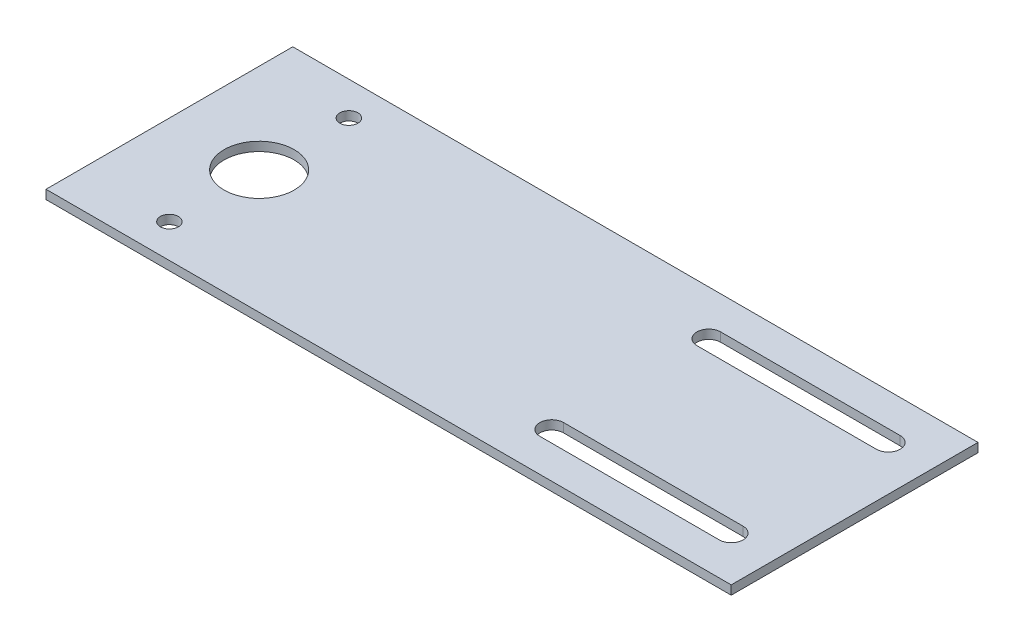
ISO-10303-21;
HEADER;
FILE_DESCRIPTION(('STEP AP214'),'2;1');
FILE_NAME('part.step','',(''),(''),'','','');
FILE_SCHEMA(('AUTOMOTIVE_DESIGN { 1 0 10303 214 1 1 1 1 }'));
ENDSEC;
DATA;
#1=APPLICATION_CONTEXT('core data for automotive mechanical design processes');
#2=APPLICATION_PROTOCOL_DEFINITION('international standard','automotive_design',2000,#1);
#3=PRODUCT_CONTEXT('',#1,'mechanical');
#4=PRODUCT('Part','Part','',(#3));
#5=PRODUCT_RELATED_PRODUCT_CATEGORY('part','',(#4));
#6=PRODUCT_DEFINITION_FORMATION('','',#4);
#7=PRODUCT_DEFINITION_CONTEXT('part definition',#1,'design');
#8=PRODUCT_DEFINITION('design','',#6,#7);
#9=PRODUCT_DEFINITION_SHAPE('','',#8);
#10=(LENGTH_UNIT() NAMED_UNIT(*) SI_UNIT(.MILLI.,.METRE.));
#11=(NAMED_UNIT(*) PLANE_ANGLE_UNIT() SI_UNIT($,.RADIAN.));
#12=(NAMED_UNIT(*) SI_UNIT($,.STERADIAN.) SOLID_ANGLE_UNIT());
#13=UNCERTAINTY_MEASURE_WITH_UNIT(LENGTH_MEASURE(1.E-05),#10,'distance_accuracy_value','');
#14=(GEOMETRIC_REPRESENTATION_CONTEXT(3) GLOBAL_UNCERTAINTY_ASSIGNED_CONTEXT((#13)) GLOBAL_UNIT_ASSIGNED_CONTEXT((#10,
#11,#12)) REPRESENTATION_CONTEXT('',''));
#15=CARTESIAN_POINT('',(0.,0.,0.));
#16=DIRECTION('',(0.,0.,1.));
#17=DIRECTION('',(1.,0.,0.));
#18=AXIS2_PLACEMENT_3D('',#15,#16,#17);
#19=CARTESIAN_POINT('',(74.5647340050886,0.,-69.85));
#20=DIRECTION('',(0.,0.,-1.));
#21=DIRECTION('',(1.,0.,0.));
#22=AXIS2_PLACEMENT_3D('',#19,#20,#21);
#23=PLANE('',#22);
#24=DIRECTION('',(1.,0.,0.));
#25=VECTOR('',#24,1.);
#26=CARTESIAN_POINT('',(74.5647340050886,0.,-69.85));
#27=LINE('',#26,#25);
#28=CARTESIAN_POINT('',(0.,0.,-69.85));
#29=VERTEX_POINT('',#28);
#30=CARTESIAN_POINT('',(193.944734005089,0.,-69.85));
#31=VERTEX_POINT('',#30);
#32=EDGE_CURVE('E189',#29,#31,#27,.T.);
#33=ORIENTED_EDGE('',*,*,#32,.F.);
#34=DIRECTION('',(0.,-1.,0.));
#35=VECTOR('',#34,1.);
#36=CARTESIAN_POINT('',(0.,0.,-69.85));
#37=LINE('',#36,#35);
#38=CARTESIAN_POINT('',(0.,2.54,-69.85));
#39=VERTEX_POINT('',#38);
#40=EDGE_CURVE('E115',#39,#29,#37,.T.);
#41=ORIENTED_EDGE('',*,*,#40,.F.);
#42=DIRECTION('',(1.,0.,0.));
#43=VECTOR('',#42,1.);
#44=CARTESIAN_POINT('',(74.5647340050886,2.54,-69.85));
#45=LINE('',#44,#43);
#46=CARTESIAN_POINT('',(193.944734005089,2.54000000000001,-69.85));
#47=VERTEX_POINT('',#46);
#48=EDGE_CURVE('E113',#39,#47,#45,.T.);
#49=ORIENTED_EDGE('',*,*,#48,.T.);
#50=DIRECTION('',(0.,-1.,0.));
#51=VECTOR('',#50,1.);
#52=CARTESIAN_POINT('',(193.944734005089,0.,-69.85));
#53=LINE('',#52,#51);
#54=EDGE_CURVE('E12',#47,#31,#53,.T.);
#55=ORIENTED_EDGE('',*,*,#54,.T.);
#56=EDGE_LOOP('',(#33,#41,#49,#55));
#57=FACE_BOUND('',#56,.T.);
#58=ADVANCED_FACE('F47',(#57),#23,.T.);
#59=CARTESIAN_POINT('',(193.944734005089,0.,-69.85));
#60=DIRECTION('',(1.,0.,0.));
#61=DIRECTION('',(0.,0.,1.));
#62=AXIS2_PLACEMENT_3D('',#59,#60,#61);
#63=PLANE('',#62);
#64=ORIENTED_EDGE('',*,*,#54,.F.);
#65=DIRECTION('',(0.,0.,-1.));
#66=VECTOR('',#65,1.);
#67=CARTESIAN_POINT('',(193.944734005089,2.54000000000001,-69.85));
#68=LINE('',#67,#66);
#69=CARTESIAN_POINT('',(193.944734005089,2.54000000000001,0.));
#70=VERTEX_POINT('',#69);
#71=EDGE_CURVE('E105',#47,#70,#68,.F.);
#72=ORIENTED_EDGE('',*,*,#71,.T.);
#73=DIRECTION('',(0.,-1.,0.));
#74=VECTOR('',#73,1.);
#75=CARTESIAN_POINT('',(193.944734005089,0.,0.));
#76=LINE('',#75,#74);
#77=CARTESIAN_POINT('',(193.944734005089,0.,0.));
#78=VERTEX_POINT('',#77);
#79=EDGE_CURVE('E56',#70,#78,#76,.T.);
#80=ORIENTED_EDGE('',*,*,#79,.T.);
#81=DIRECTION('',(0.,0.,1.));
#82=VECTOR('',#81,1.);
#83=CARTESIAN_POINT('',(193.944734005089,0.,-69.85));
#84=LINE('',#83,#82);
#85=EDGE_CURVE('E107',#31,#78,#84,.T.);
#86=ORIENTED_EDGE('',*,*,#85,.F.);
#87=EDGE_LOOP('',(#64,#72,#80,#86));
#88=FACE_BOUND('',#87,.T.);
#89=ADVANCED_FACE('F103',(#88),#63,.T.);
#90=CARTESIAN_POINT('',(74.5647340050886,0.,0.));
#91=DIRECTION('',(0.,0.,-1.));
#92=DIRECTION('',(1.,0.,0.));
#93=AXIS2_PLACEMENT_3D('',#90,#91,#92);
#94=PLANE('',#93);
#95=ORIENTED_EDGE('',*,*,#79,.F.);
#96=DIRECTION('',(1.,0.,0.));
#97=VECTOR('',#96,1.);
#98=CARTESIAN_POINT('',(74.5647340050886,2.54,0.));
#99=LINE('',#98,#97);
#100=CARTESIAN_POINT('',(0.,2.54,0.));
#101=VERTEX_POINT('',#100);
#102=EDGE_CURVE('E119',#101,#70,#99,.T.);
#103=ORIENTED_EDGE('',*,*,#102,.F.);
#104=DIRECTION('',(0.,-1.,0.));
#105=VECTOR('',#104,1.);
#106=CARTESIAN_POINT('',(0.,0.,0.));
#107=LINE('',#106,#105);
#108=CARTESIAN_POINT('',(0.,0.,0.));
#109=VERTEX_POINT('',#108);
#110=EDGE_CURVE('E240',#101,#109,#107,.T.);
#111=ORIENTED_EDGE('',*,*,#110,.T.);
#112=DIRECTION('',(1.,0.,0.));
#113=VECTOR('',#112,1.);
#114=CARTESIAN_POINT('',(74.5647340050886,0.,0.));
#115=LINE('',#114,#113);
#116=EDGE_CURVE('E187',#109,#78,#115,.T.);
#117=ORIENTED_EDGE('',*,*,#116,.T.);
#118=EDGE_LOOP('',(#95,#103,#111,#117));
#119=FACE_BOUND('',#118,.T.);
#120=ADVANCED_FACE('F241',(#119),#94,.F.);
#121=CARTESIAN_POINT('',(130.444734005089,0.,-12.7));
#122=DIRECTION('',(0.,-1.,0.));
#123=DIRECTION('',(0.,0.,-1.));
#124=AXIS2_PLACEMENT_3D('',#121,#122,#123);
#125=CYLINDRICAL_SURFACE('',#124,3.3655);
#126=DIRECTION('',(0.,-1.,0.));
#127=VECTOR('',#126,1.);
#128=CARTESIAN_POINT('',(130.444734005089,0.,-16.0655));
#129=LINE('',#128,#127);
#130=CARTESIAN_POINT('',(130.444734005089,2.54,-16.0655));
#131=VERTEX_POINT('',#130);
#132=CARTESIAN_POINT('',(130.444734005089,0.,-16.0655));
#133=VERTEX_POINT('',#132);
#134=EDGE_CURVE('E149',#131,#133,#129,.T.);
#135=ORIENTED_EDGE('',*,*,#134,.F.);
#136=CARTESIAN_POINT('',(130.444734005089,2.53999999999999,-12.7));
#137=DIRECTION('',(0.,1.,0.));
#138=DIRECTION('',(-1.,0.,0.));
#139=AXIS2_PLACEMENT_3D('',#136,#137,#138);
#140=CIRCLE('',#139,3.3655);
#141=CARTESIAN_POINT('',(130.444734005089,2.54,-9.33449999999999));
#142=VERTEX_POINT('',#141);
#143=EDGE_CURVE('E210',#131,#142,#140,.T.);
#144=ORIENTED_EDGE('',*,*,#143,.T.);
#145=DIRECTION('',(0.,-1.,0.));
#146=VECTOR('',#145,1.);
#147=CARTESIAN_POINT('',(130.444734005089,0.,-9.33449999999999));
#148=LINE('',#147,#146);
#149=CARTESIAN_POINT('',(130.444734005089,0.,-9.33449999999999));
#150=VERTEX_POINT('',#149);
#151=EDGE_CURVE('E146',#142,#150,#148,.T.);
#152=ORIENTED_EDGE('',*,*,#151,.T.);
#153=CARTESIAN_POINT('',(130.444734005089,0.,-12.7));
#154=DIRECTION('',(0.,1.,0.));
#155=DIRECTION('',(-1.,0.,0.));
#156=AXIS2_PLACEMENT_3D('',#153,#154,#155);
#157=CIRCLE('',#156,3.3655);
#158=EDGE_CURVE('E181',#133,#150,#157,.T.);
#159=ORIENTED_EDGE('',*,*,#158,.F.);
#160=EDGE_LOOP('',(#135,#144,#152,#159));
#161=FACE_BOUND('',#160,.T.);
#162=ADVANCED_FACE('F216',(#161),#125,.F.);
#163=CARTESIAN_POINT('',(181.244734005089,0.,-9.33449999999999));
#164=DIRECTION('',(0.,0.,-1.));
#165=DIRECTION('',(1.,0.,0.));
#166=AXIS2_PLACEMENT_3D('',#163,#164,#165);
#167=PLANE('',#166);
#168=ORIENTED_EDGE('',*,*,#151,.F.);
#169=DIRECTION('',(1.,0.,0.));
#170=VECTOR('',#169,1.);
#171=CARTESIAN_POINT('',(74.5647340050886,2.54,-9.33449999999999));
#172=LINE('',#171,#170);
#173=CARTESIAN_POINT('',(181.244734005089,2.54,-9.33449999999999));
#174=VERTEX_POINT('',#173);
#175=EDGE_CURVE('E207',#142,#174,#172,.T.);
#176=ORIENTED_EDGE('',*,*,#175,.T.);
#177=DIRECTION('',(0.,-1.,0.));
#178=VECTOR('',#177,1.);
#179=CARTESIAN_POINT('',(181.244734005089,0.,-9.33449999999999));
#180=LINE('',#179,#178);
#181=CARTESIAN_POINT('',(181.244734005089,0.,-9.33449999999999));
#182=VERTEX_POINT('',#181);
#183=EDGE_CURVE('E143',#174,#182,#180,.T.);
#184=ORIENTED_EDGE('',*,*,#183,.T.);
#185=DIRECTION('',(1.,0.,0.));
#186=VECTOR('',#185,1.);
#187=CARTESIAN_POINT('',(181.244734005089,0.,-9.33449999999999));
#188=LINE('',#187,#186);
#189=EDGE_CURVE('E177',#150,#182,#188,.T.);
#190=ORIENTED_EDGE('',*,*,#189,.F.);
#191=EDGE_LOOP('',(#168,#176,#184,#190));
#192=FACE_BOUND('',#191,.T.);
#193=ADVANCED_FACE('F221',(#192),#167,.T.);
#194=CARTESIAN_POINT('',(181.244734005089,0.,-12.7));
#195=DIRECTION('',(0.,-1.,0.));
#196=DIRECTION('',(0.,0.,-1.));
#197=AXIS2_PLACEMENT_3D('',#194,#195,#196);
#198=CYLINDRICAL_SURFACE('',#197,3.3655);
#199=ORIENTED_EDGE('',*,*,#183,.F.);
#200=CARTESIAN_POINT('',(181.244734005089,2.53999999999999,-12.7));
#201=DIRECTION('',(0.,1.,0.));
#202=DIRECTION('',(-1.,0.,0.));
#203=AXIS2_PLACEMENT_3D('',#200,#201,#202);
#204=CIRCLE('',#203,3.3655);
#205=CARTESIAN_POINT('',(181.244734005089,2.54,-16.0655));
#206=VERTEX_POINT('',#205);
#207=EDGE_CURVE('E162',#174,#206,#204,.T.);
#208=ORIENTED_EDGE('',*,*,#207,.T.);
#209=DIRECTION('',(0.,-1.,0.));
#210=VECTOR('',#209,1.);
#211=CARTESIAN_POINT('',(181.244734005089,0.,-16.0655));
#212=LINE('',#211,#210);
#213=CARTESIAN_POINT('',(181.244734005089,0.,-16.0655));
#214=VERTEX_POINT('',#213);
#215=EDGE_CURVE('E141',#206,#214,#212,.T.);
#216=ORIENTED_EDGE('',*,*,#215,.T.);
#217=CARTESIAN_POINT('',(181.244734005089,0.,-12.7));
#218=DIRECTION('',(0.,1.,0.));
#219=DIRECTION('',(-1.,0.,0.));
#220=AXIS2_PLACEMENT_3D('',#217,#218,#219);
#221=CIRCLE('',#220,3.3655);
#222=EDGE_CURVE('E159',#182,#214,#221,.T.);
#223=ORIENTED_EDGE('',*,*,#222,.F.);
#224=EDGE_LOOP('',(#199,#208,#216,#223));
#225=FACE_BOUND('',#224,.T.);
#226=ADVANCED_FACE('F158',(#225),#198,.F.);
#227=CARTESIAN_POINT('',(130.444734005089,0.,-57.15));
#228=DIRECTION('',(0.,-1.,0.));
#229=DIRECTION('',(0.,0.,-1.));
#230=AXIS2_PLACEMENT_3D('',#227,#228,#229);
#231=CYLINDRICAL_SURFACE('',#230,3.3655);
#232=DIRECTION('',(0.,-1.,0.));
#233=VECTOR('',#232,1.);
#234=CARTESIAN_POINT('',(130.444734005089,0.,-60.5155));
#235=LINE('',#234,#233);
#236=CARTESIAN_POINT('',(130.444734005089,2.54,-60.5155));
#237=VERTEX_POINT('',#236);
#238=CARTESIAN_POINT('',(130.444734005089,0.,-60.5155));
#239=VERTEX_POINT('',#238);
#240=EDGE_CURVE('E138',#237,#239,#235,.T.);
#241=ORIENTED_EDGE('',*,*,#240,.F.);
#242=CARTESIAN_POINT('',(130.444734005089,2.53999999999999,-57.15));
#243=DIRECTION('',(0.,1.,0.));
#244=DIRECTION('',(-1.,0.,0.));
#245=AXIS2_PLACEMENT_3D('',#242,#243,#244);
#246=CIRCLE('',#245,3.3655);
#247=CARTESIAN_POINT('',(130.444734005089,2.54,-53.7845));
#248=VERTEX_POINT('',#247);
#249=EDGE_CURVE('E200',#237,#248,#246,.T.);
#250=ORIENTED_EDGE('',*,*,#249,.T.);
#251=DIRECTION('',(0.,-1.,0.));
#252=VECTOR('',#251,1.);
#253=CARTESIAN_POINT('',(130.444734005089,0.,-53.7845));
#254=LINE('',#253,#252);
#255=CARTESIAN_POINT('',(130.444734005089,0.,-53.7845));
#256=VERTEX_POINT('',#255);
#257=EDGE_CURVE('E134',#248,#256,#254,.T.);
#258=ORIENTED_EDGE('',*,*,#257,.T.);
#259=CARTESIAN_POINT('',(130.444734005089,0.,-57.15));
#260=DIRECTION('',(0.,1.,0.));
#261=DIRECTION('',(-1.,0.,0.));
#262=AXIS2_PLACEMENT_3D('',#259,#260,#261);
#263=CIRCLE('',#262,3.3655);
#264=EDGE_CURVE('E257',#239,#256,#263,.T.);
#265=ORIENTED_EDGE('',*,*,#264,.F.);
#266=EDGE_LOOP('',(#241,#250,#258,#265));
#267=FACE_BOUND('',#266,.T.);
#268=ADVANCED_FACE('F277',(#267),#231,.F.);
#269=CARTESIAN_POINT('',(181.244734005089,0.,-53.7845));
#270=DIRECTION('',(0.,0.,-1.));
#271=DIRECTION('',(1.,0.,0.));
#272=AXIS2_PLACEMENT_3D('',#269,#270,#271);
#273=PLANE('',#272);
#274=ORIENTED_EDGE('',*,*,#257,.F.);
#275=DIRECTION('',(1.,0.,0.));
#276=VECTOR('',#275,1.);
#277=CARTESIAN_POINT('',(74.5647340050886,2.54,-53.7845));
#278=LINE('',#277,#276);
#279=CARTESIAN_POINT('',(181.244734005089,2.54,-53.7845));
#280=VERTEX_POINT('',#279);
#281=EDGE_CURVE('E197',#248,#280,#278,.T.);
#282=ORIENTED_EDGE('',*,*,#281,.T.);
#283=DIRECTION('',(0.,-1.,0.));
#284=VECTOR('',#283,1.);
#285=CARTESIAN_POINT('',(181.244734005089,0.,-53.7845));
#286=LINE('',#285,#284);
#287=CARTESIAN_POINT('',(181.244734005089,0.,-53.7845));
#288=VERTEX_POINT('',#287);
#289=EDGE_CURVE('E131',#280,#288,#286,.T.);
#290=ORIENTED_EDGE('',*,*,#289,.T.);
#291=DIRECTION('',(1.,0.,0.));
#292=VECTOR('',#291,1.);
#293=CARTESIAN_POINT('',(181.244734005089,0.,-53.7845));
#294=LINE('',#293,#292);
#295=EDGE_CURVE('E178',#256,#288,#294,.T.);
#296=ORIENTED_EDGE('',*,*,#295,.F.);
#297=EDGE_LOOP('',(#274,#282,#290,#296));
#298=FACE_BOUND('',#297,.T.);
#299=ADVANCED_FACE('F266',(#298),#273,.T.);
#300=CARTESIAN_POINT('',(181.244734005089,0.,-57.15));
#301=DIRECTION('',(0.,-1.,0.));
#302=DIRECTION('',(0.,0.,-1.));
#303=AXIS2_PLACEMENT_3D('',#300,#301,#302);
#304=CYLINDRICAL_SURFACE('',#303,3.3655);
#305=ORIENTED_EDGE('',*,*,#289,.F.);
#306=CARTESIAN_POINT('',(181.244734005089,2.53999999999999,-57.15));
#307=DIRECTION('',(0.,1.,0.));
#308=DIRECTION('',(-1.,0.,0.));
#309=AXIS2_PLACEMENT_3D('',#306,#307,#308);
#310=CIRCLE('',#309,3.3655);
#311=CARTESIAN_POINT('',(181.244734005089,2.54,-60.5155));
#312=VERTEX_POINT('',#311);
#313=EDGE_CURVE('E192',#280,#312,#310,.T.);
#314=ORIENTED_EDGE('',*,*,#313,.T.);
#315=DIRECTION('',(0.,-1.,0.));
#316=VECTOR('',#315,1.);
#317=CARTESIAN_POINT('',(181.244734005089,0.,-60.5155));
#318=LINE('',#317,#316);
#319=CARTESIAN_POINT('',(181.244734005089,0.,-60.5155));
#320=VERTEX_POINT('',#319);
#321=EDGE_CURVE('E135',#312,#320,#318,.T.);
#322=ORIENTED_EDGE('',*,*,#321,.T.);
#323=CARTESIAN_POINT('',(181.244734005089,0.,-57.15));
#324=DIRECTION('',(0.,1.,0.));
#325=DIRECTION('',(-1.,0.,0.));
#326=AXIS2_PLACEMENT_3D('',#323,#324,#325);
#327=CIRCLE('',#326,3.3655);
#328=EDGE_CURVE('E123',#288,#320,#327,.T.);
#329=ORIENTED_EDGE('',*,*,#328,.F.);
#330=EDGE_LOOP('',(#305,#314,#322,#329));
#331=FACE_BOUND('',#330,.T.);
#332=ADVANCED_FACE('F270',(#331),#304,.F.);
#333=CARTESIAN_POINT('',(181.244734005089,0.,-60.5155));
#334=DIRECTION('',(0.,0.,1.));
#335=DIRECTION('',(-1.,0.,0.));
#336=AXIS2_PLACEMENT_3D('',#333,#334,#335);
#337=PLANE('',#336);
#338=DIRECTION('',(1.,0.,0.));
#339=VECTOR('',#338,1.);
#340=CARTESIAN_POINT('',(74.5647340050886,2.54,-60.5155));
#341=LINE('',#340,#339);
#342=EDGE_CURVE('E195',#312,#237,#341,.F.);
#343=ORIENTED_EDGE('',*,*,#342,.T.);
#344=ORIENTED_EDGE('',*,*,#240,.T.);
#345=DIRECTION('',(-1.,0.,0.));
#346=VECTOR('',#345,1.);
#347=CARTESIAN_POINT('',(181.244734005089,0.,-60.5155));
#348=LINE('',#347,#346);
#349=EDGE_CURVE('E126',#320,#239,#348,.T.);
#350=ORIENTED_EDGE('',*,*,#349,.F.);
#351=ORIENTED_EDGE('',*,*,#321,.F.);
#352=EDGE_LOOP('',(#343,#344,#350,#351));
#353=FACE_BOUND('',#352,.T.);
#354=ADVANCED_FACE('F273',(#353),#337,.T.);
#355=CARTESIAN_POINT('',(181.244734005089,0.,-16.0655));
#356=DIRECTION('',(0.,0.,1.));
#357=DIRECTION('',(-1.,0.,0.));
#358=AXIS2_PLACEMENT_3D('',#355,#356,#357);
#359=PLANE('',#358);
#360=DIRECTION('',(1.,0.,0.));
#361=VECTOR('',#360,1.);
#362=CARTESIAN_POINT('',(74.5647340050886,2.54,-16.0655));
#363=LINE('',#362,#361);
#364=EDGE_CURVE('E206',#206,#131,#363,.F.);
#365=ORIENTED_EDGE('',*,*,#364,.T.);
#366=ORIENTED_EDGE('',*,*,#134,.T.);
#367=DIRECTION('',(-1.,0.,0.));
#368=VECTOR('',#367,1.);
#369=CARTESIAN_POINT('',(181.244734005089,0.,-16.0655));
#370=LINE('',#369,#368);
#371=EDGE_CURVE('E174',#214,#133,#370,.T.);
#372=ORIENTED_EDGE('',*,*,#371,.F.);
#373=ORIENTED_EDGE('',*,*,#215,.F.);
#374=EDGE_LOOP('',(#365,#366,#372,#373));
#375=FACE_BOUND('',#374,.T.);
#376=ADVANCED_FACE('F180',(#375),#359,.T.);
#377=CARTESIAN_POINT('',(0.,0.,-69.85));
#378=DIRECTION('',(0.,-1.,0.));
#379=DIRECTION('',(0.,0.,-1.));
#380=AXIS2_PLACEMENT_3D('',#377,#378,#379);
#381=PLANE('',#380);
#382=ORIENTED_EDGE('',*,*,#328,.T.);
#383=ORIENTED_EDGE('',*,*,#349,.T.);
#384=ORIENTED_EDGE('',*,*,#264,.T.);
#385=ORIENTED_EDGE('',*,*,#295,.T.);
#386=EDGE_LOOP('',(#382,#383,#384,#385));
#387=FACE_BOUND('',#386,.T.);
#388=ORIENTED_EDGE('',*,*,#222,.T.);
#389=ORIENTED_EDGE('',*,*,#371,.T.);
#390=ORIENTED_EDGE('',*,*,#158,.T.);
#391=ORIENTED_EDGE('',*,*,#189,.T.);
#392=EDGE_LOOP('',(#388,#389,#390,#391));
#393=FACE_BOUND('',#392,.T.);
#394=ORIENTED_EDGE('',*,*,#116,.F.);
#395=DIRECTION('',(0.,0.,1.));
#396=VECTOR('',#395,1.);
#397=CARTESIAN_POINT('',(0.,0.,-69.85));
#398=LINE('',#397,#396);
#399=EDGE_CURVE('E238',#29,#109,#398,.T.);
#400=ORIENTED_EDGE('',*,*,#399,.F.);
#401=ORIENTED_EDGE('',*,*,#32,.T.);
#402=ORIENTED_EDGE('',*,*,#85,.T.);
#403=EDGE_LOOP('',(#394,#400,#401,#402));
#404=FACE_BOUND('',#403,.T.);
#405=CARTESIAN_POINT('',(25.4,0.,-34.925));
#406=DIRECTION('',(0.,-1.,0.));
#407=DIRECTION('',(0.,0.,-1.));
#408=AXIS2_PLACEMENT_3D('',#405,#406,#407);
#409=CIRCLE('',#408,9.921875);
#410=CARTESIAN_POINT('',(25.4,0.,-44.846875));
#411=VERTEX_POINT('',#410);
#412=EDGE_CURVE('E584',#411,#411,#409,.T.);
#413=ORIENTED_EDGE('',*,*,#412,.F.);
#414=EDGE_LOOP('',(#413));
#415=FACE_BOUND('',#414,.T.);
#416=CARTESIAN_POINT('',(25.3999999999999,0.,-9.5249999999993));
#417=DIRECTION('',(0.,1.,0.));
#418=DIRECTION('',(0.,0.,1.));
#419=AXIS2_PLACEMENT_3D('',#416,#417,#418);
#420=CIRCLE('',#419,2.5527);
#421=CARTESIAN_POINT('',(25.3999999999999,0.,-6.9722999999993));
#422=VERTEX_POINT('',#421);
#423=EDGE_CURVE('E581',#422,#422,#420,.T.);
#424=ORIENTED_EDGE('',*,*,#423,.T.);
#425=EDGE_LOOP('',(#424));
#426=FACE_BOUND('',#425,.T.);
#427=CARTESIAN_POINT('',(25.3999999999999,0.,-60.3249999999999));
#428=DIRECTION('',(0.,1.,0.));
#429=DIRECTION('',(0.,0.,1.));
#430=AXIS2_PLACEMENT_3D('',#427,#428,#429);
#431=CIRCLE('',#430,2.5527);
#432=CARTESIAN_POINT('',(25.3999999999999,0.,-57.7722999999999));
#433=VERTEX_POINT('',#432);
#434=EDGE_CURVE('E244',#433,#433,#431,.T.);
#435=ORIENTED_EDGE('',*,*,#434,.T.);
#436=EDGE_LOOP('',(#435));
#437=FACE_BOUND('',#436,.T.);
#438=ADVANCED_FACE('F49',(#387,#393,#404,#415,#426,#437),#381,.T.);
#439=CARTESIAN_POINT('',(74.5647340050886,2.54,-69.85));
#440=DIRECTION('',(0.,-1.,0.));
#441=DIRECTION('',(0.,0.,-1.));
#442=AXIS2_PLACEMENT_3D('',#439,#440,#441);
#443=PLANE('',#442);
#444=ORIENTED_EDGE('',*,*,#313,.F.);
#445=ORIENTED_EDGE('',*,*,#281,.F.);
#446=ORIENTED_EDGE('',*,*,#249,.F.);
#447=ORIENTED_EDGE('',*,*,#342,.F.);
#448=EDGE_LOOP('',(#444,#445,#446,#447));
#449=FACE_BOUND('',#448,.T.);
#450=ORIENTED_EDGE('',*,*,#207,.F.);
#451=ORIENTED_EDGE('',*,*,#175,.F.);
#452=ORIENTED_EDGE('',*,*,#143,.F.);
#453=ORIENTED_EDGE('',*,*,#364,.F.);
#454=EDGE_LOOP('',(#450,#451,#452,#453));
#455=FACE_BOUND('',#454,.T.);
#456=ORIENTED_EDGE('',*,*,#102,.T.);
#457=ORIENTED_EDGE('',*,*,#71,.F.);
#458=ORIENTED_EDGE('',*,*,#48,.F.);
#459=DIRECTION('',(0.,0.,-1.));
#460=VECTOR('',#459,1.);
#461=CARTESIAN_POINT('',(0.,2.54,-69.85));
#462=LINE('',#461,#460);
#463=EDGE_CURVE('E196',#39,#101,#462,.F.);
#464=ORIENTED_EDGE('',*,*,#463,.T.);
#465=EDGE_LOOP('',(#456,#457,#458,#464));
#466=FACE_BOUND('',#465,.T.);
#467=CARTESIAN_POINT('',(25.4,2.54,-34.925));
#468=DIRECTION('',(0.,-1.,0.));
#469=DIRECTION('',(0.,0.,-1.));
#470=AXIS2_PLACEMENT_3D('',#467,#468,#469);
#471=CIRCLE('',#470,9.921875);
#472=CARTESIAN_POINT('',(25.4,2.54,-44.846875));
#473=VERTEX_POINT('',#472);
#474=EDGE_CURVE('E243',#473,#473,#471,.T.);
#475=ORIENTED_EDGE('',*,*,#474,.T.);
#476=EDGE_LOOP('',(#475));
#477=FACE_BOUND('',#476,.T.);
#478=CARTESIAN_POINT('',(25.3999999999999,2.54,-9.5249999999993));
#479=DIRECTION('',(0.,1.,0.));
#480=DIRECTION('',(0.,0.,1.));
#481=AXIS2_PLACEMENT_3D('',#478,#479,#480);
#482=CIRCLE('',#481,2.5527);
#483=CARTESIAN_POINT('',(25.3999999999999,2.54,-6.9722999999993));
#484=VERTEX_POINT('',#483);
#485=EDGE_CURVE('E250',#484,#484,#482,.T.);
#486=ORIENTED_EDGE('',*,*,#485,.F.);
#487=EDGE_LOOP('',(#486));
#488=FACE_BOUND('',#487,.T.);
#489=CARTESIAN_POINT('',(25.3999999999999,2.54,-60.3249999999999));
#490=DIRECTION('',(0.,1.,0.));
#491=DIRECTION('',(0.,0.,1.));
#492=AXIS2_PLACEMENT_3D('',#489,#490,#491);
#493=CIRCLE('',#492,2.5527);
#494=CARTESIAN_POINT('',(25.3999999999999,2.54,-57.7722999999999));
#495=VERTEX_POINT('',#494);
#496=EDGE_CURVE('E247',#495,#495,#493,.T.);
#497=ORIENTED_EDGE('',*,*,#496,.F.);
#498=EDGE_LOOP('',(#497));
#499=FACE_BOUND('',#498,.T.);
#500=ADVANCED_FACE('F121',(#449,#455,#466,#477,#488,#499),#443,.F.);
#501=CARTESIAN_POINT('',(0.,0.,-69.85));
#502=DIRECTION('',(1.,0.,0.));
#503=DIRECTION('',(0.,0.,1.));
#504=AXIS2_PLACEMENT_3D('',#501,#502,#503);
#505=PLANE('',#504);
#506=ORIENTED_EDGE('',*,*,#110,.F.);
#507=ORIENTED_EDGE('',*,*,#463,.F.);
#508=ORIENTED_EDGE('',*,*,#40,.T.);
#509=ORIENTED_EDGE('',*,*,#399,.T.);
#510=EDGE_LOOP('',(#506,#507,#508,#509));
#511=FACE_BOUND('',#510,.T.);
#512=ADVANCED_FACE('F246',(#511),#505,.F.);
#513=CARTESIAN_POINT('',(25.3999999999999,0.,-60.3249999999999));
#514=DIRECTION('',(0.,-1.,0.));
#515=DIRECTION('',(0.,0.,-1.));
#516=AXIS2_PLACEMENT_3D('',#513,#514,#515);
#517=CYLINDRICAL_SURFACE('',#516,2.5527);
#518=ORIENTED_EDGE('',*,*,#434,.F.);
#519=EDGE_LOOP('',(#518));
#520=FACE_BOUND('',#519,.T.);
#521=ORIENTED_EDGE('',*,*,#496,.T.);
#522=EDGE_LOOP('',(#521));
#523=FACE_BOUND('',#522,.T.);
#524=ADVANCED_FACE('F317',(#520,#523),#517,.F.);
#525=CARTESIAN_POINT('',(25.3999999999999,0.,-9.5249999999993));
#526=DIRECTION('',(0.,-1.,0.));
#527=DIRECTION('',(0.,0.,-1.));
#528=AXIS2_PLACEMENT_3D('',#525,#526,#527);
#529=CYLINDRICAL_SURFACE('',#528,2.5527);
#530=ORIENTED_EDGE('',*,*,#423,.F.);
#531=EDGE_LOOP('',(#530));
#532=FACE_BOUND('',#531,.T.);
#533=ORIENTED_EDGE('',*,*,#485,.T.);
#534=EDGE_LOOP('',(#533));
#535=FACE_BOUND('',#534,.T.);
#536=ADVANCED_FACE('F313',(#532,#535),#529,.F.);
#537=CARTESIAN_POINT('',(25.4,0.,-34.925));
#538=DIRECTION('',(0.,-1.,0.));
#539=DIRECTION('',(0.,0.,-1.));
#540=AXIS2_PLACEMENT_3D('',#537,#538,#539);
#541=CYLINDRICAL_SURFACE('',#540,9.921875);
#542=ORIENTED_EDGE('',*,*,#412,.T.);
#543=EDGE_LOOP('',(#542));
#544=FACE_BOUND('',#543,.T.);
#545=ORIENTED_EDGE('',*,*,#474,.F.);
#546=EDGE_LOOP('',(#545));
#547=FACE_BOUND('',#546,.T.);
#548=ADVANCED_FACE('F310',(#544,#547),#541,.F.);
#549=CLOSED_SHELL('',(#58,#89,#120,#162,#193,#226,#268,#299,#332,#354,#376,#438,#500,#512,#524,
#536,#548));
#550=MANIFOLD_SOLID_BREP('B2',#549);
#551=ADVANCED_BREP_SHAPE_REPRESENTATION('',(#18,#550),#14);
#552=SHAPE_DEFINITION_REPRESENTATION(#9,#551);
ENDSEC;
END-ISO-10303-21;
